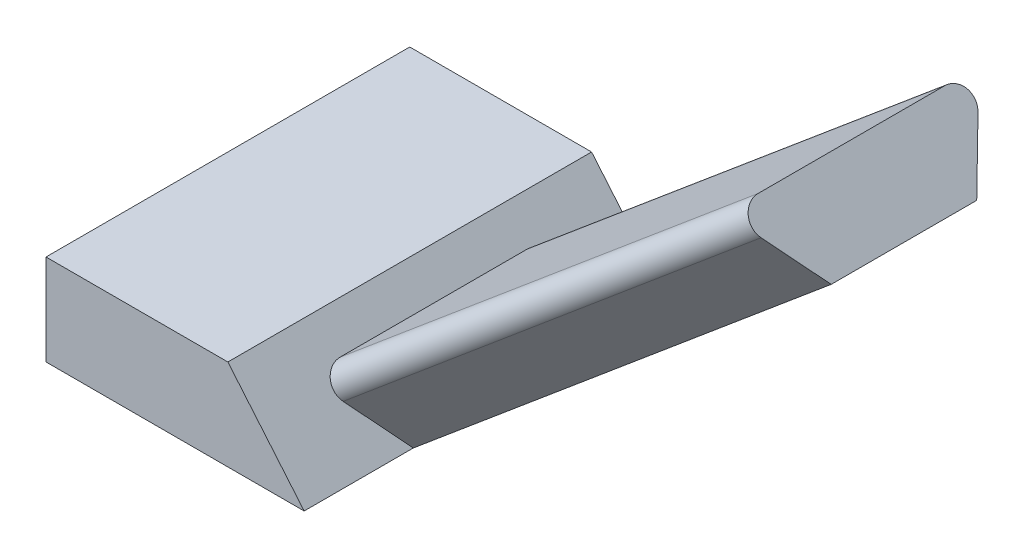
ISO-10303-21;
HEADER;
FILE_DESCRIPTION(('STEP AP214'),'2;1');
FILE_NAME('part.step','',(''),(''),'','','');
FILE_SCHEMA(('AUTOMOTIVE_DESIGN { 1 0 10303 214 1 1 1 1 }'));
ENDSEC;
DATA;
#1=APPLICATION_CONTEXT('core data for automotive mechanical design processes');
#2=APPLICATION_PROTOCOL_DEFINITION('international standard','automotive_design',2000,#1);
#3=PRODUCT_CONTEXT('',#1,'mechanical');
#4=PRODUCT('Part','Part','',(#3));
#5=PRODUCT_RELATED_PRODUCT_CATEGORY('part','',(#4));
#6=PRODUCT_DEFINITION_FORMATION('','',#4);
#7=PRODUCT_DEFINITION_CONTEXT('part definition',#1,'design');
#8=PRODUCT_DEFINITION('design','',#6,#7);
#9=PRODUCT_DEFINITION_SHAPE('','',#8);
#10=(LENGTH_UNIT() NAMED_UNIT(*) SI_UNIT(.MILLI.,.METRE.));
#11=(NAMED_UNIT(*) PLANE_ANGLE_UNIT() SI_UNIT($,.RADIAN.));
#12=(NAMED_UNIT(*) SI_UNIT($,.STERADIAN.) SOLID_ANGLE_UNIT());
#13=UNCERTAINTY_MEASURE_WITH_UNIT(LENGTH_MEASURE(1.E-05),#10,'distance_accuracy_value','');
#14=(GEOMETRIC_REPRESENTATION_CONTEXT(3) GLOBAL_UNCERTAINTY_ASSIGNED_CONTEXT((#13)) GLOBAL_UNIT_ASSIGNED_CONTEXT((#10,
#11,#12)) REPRESENTATION_CONTEXT('',''));
#15=CARTESIAN_POINT('',(0.,0.,0.));
#16=DIRECTION('',(0.,0.,1.));
#17=DIRECTION('',(1.,0.,0.));
#18=AXIS2_PLACEMENT_3D('',#15,#16,#17);
#19=CARTESIAN_POINT('',(10.,5.,10.));
#20=DIRECTION('',(-0.766044443118974,-0.642787609686544,0.));
#21=DIRECTION('',(0.642787609686544,-0.766044443118974,0.));
#22=AXIS2_PLACEMENT_3D('',#19,#20,#21);
#23=PLANE('',#22);
#24=DIRECTION('',(0.534831619836407,-0.637387504373012,-0.55470019622523));
#25=VECTOR('',#24,1.);
#26=CARTESIAN_POINT('',(14.1954981558864,0.,4.));
#27=LINE('',#26,#25);
#28=CARTESIAN_POINT('',(12.3022959352078,2.25623054800107,5.96353320251652));
#29=VERTEX_POINT('',#28);
#30=CARTESIAN_POINT('',(14.1954981558864,0.,4.));
#31=VERTEX_POINT('',#30);
#32=EDGE_CURVE('E57',#29,#31,#27,.T.);
#33=ORIENTED_EDGE('',*,*,#32,.F.);
#34=CARTESIAN_POINT('',(11.9457415219835,2.68115555091641,5.13148290817867));
#35=DIRECTION('',(0.766044443118974,0.642787609686544,0.));
#36=DIRECTION('',(0.642787609686544,-0.766044443118974,0.));
#37=AXIS2_PLACEMENT_3D('',#34,#35,#36);
#38=CIRCLE('',#37,1.);
#39=CARTESIAN_POINT('',(11.302953912297,3.44719999403538,5.13148290817867));
#40=VERTEX_POINT('',#39);
#41=EDGE_CURVE('E61',#40,#29,#38,.T.);
#42=ORIENTED_EDGE('',*,*,#41,.F.);
#43=DIRECTION('',(0.,0.,1.));
#44=VECTOR('',#43,1.);
#45=CARTESIAN_POINT('',(11.302953912297,3.44719999403538,5.13148290817867));
#46=LINE('',#45,#44);
#47=CARTESIAN_POINT('',(11.302953912297,3.44719999403538,-5.13148290817867));
#48=VERTEX_POINT('',#47);
#49=EDGE_CURVE('E215',#48,#40,#46,.T.);
#50=ORIENTED_EDGE('',*,*,#49,.F.);
#51=CARTESIAN_POINT('',(11.9457415219835,2.68115555091641,-5.13148290817867));
#52=DIRECTION('',(0.766044443118974,0.642787609686544,0.));
#53=DIRECTION('',(0.642787609686544,-0.766044443118974,0.));
#54=AXIS2_PLACEMENT_3D('',#51,#52,#53);
#55=CIRCLE('',#54,1.);
#56=CARTESIAN_POINT('',(12.3022959352078,2.25623054800107,-5.96353320251651));
#57=VERTEX_POINT('',#56);
#58=EDGE_CURVE('E220',#57,#48,#55,.T.);
#59=ORIENTED_EDGE('',*,*,#58,.F.);
#60=DIRECTION('',(-0.534831619836407,0.637387504373012,-0.554700196225229));
#61=VECTOR('',#60,1.);
#62=CARTESIAN_POINT('',(12.3022959352078,2.25623054800107,-5.96353320251651));
#63=LINE('',#62,#61);
#64=CARTESIAN_POINT('',(14.1954981558864,0.,-4.));
#65=VERTEX_POINT('',#64);
#66=EDGE_CURVE('E178',#65,#57,#63,.T.);
#67=ORIENTED_EDGE('',*,*,#66,.F.);
#68=DIRECTION('',(0.,0.,-1.));
#69=VECTOR('',#68,1.);
#70=CARTESIAN_POINT('',(14.1954981558864,0.,10.));
#71=LINE('',#70,#69);
#72=CARTESIAN_POINT('',(14.1954981558864,0.,-10.));
#73=VERTEX_POINT('',#72);
#74=EDGE_CURVE('E51',#65,#73,#71,.T.);
#75=ORIENTED_EDGE('',*,*,#74,.T.);
#76=DIRECTION('',(-0.642787609686544,0.766044443118974,0.));
#77=VECTOR('',#76,1.);
#78=CARTESIAN_POINT('',(10.,5.,-10.));
#79=LINE('',#78,#77);
#80=CARTESIAN_POINT('',(10.,5.,-10.));
#81=VERTEX_POINT('',#80);
#82=EDGE_CURVE('E145',#73,#81,#79,.T.);
#83=ORIENTED_EDGE('',*,*,#82,.T.);
#84=DIRECTION('',(0.,0.,-1.));
#85=VECTOR('',#84,1.);
#86=CARTESIAN_POINT('',(10.,5.,10.));
#87=LINE('',#86,#85);
#88=CARTESIAN_POINT('',(10.,5.,10.));
#89=VERTEX_POINT('',#88);
#90=EDGE_CURVE('E170',#89,#81,#87,.T.);
#91=ORIENTED_EDGE('',*,*,#90,.F.);
#92=DIRECTION('',(-0.642787609686544,0.766044443118974,0.));
#93=VECTOR('',#92,1.);
#94=CARTESIAN_POINT('',(10.,5.,10.));
#95=LINE('',#94,#93);
#96=CARTESIAN_POINT('',(14.1954981558864,0.,10.));
#97=VERTEX_POINT('',#96);
#98=EDGE_CURVE('E154',#97,#89,#95,.T.);
#99=ORIENTED_EDGE('',*,*,#98,.F.);
#100=EDGE_CURVE('E11',#97,#31,#71,.T.);
#101=ORIENTED_EDGE('',*,*,#100,.T.);
#102=EDGE_LOOP('',(#33,#42,#50,#59,#67,#75,#83,#91,#99,#101));
#103=FACE_BOUND('',#102,.T.);
#104=ADVANCED_FACE('F43',(#103),#23,.F.);
#105=CARTESIAN_POINT('',(14.1954981558864,0.,10.));
#106=DIRECTION('',(0.,1.,0.));
#107=DIRECTION('',(-1.,0.,0.));
#108=AXIS2_PLACEMENT_3D('',#105,#106,#107);
#109=PLANE('',#108);
#110=DIRECTION('',(1.,0.,0.));
#111=VECTOR('',#110,1.);
#112=CARTESIAN_POINT('',(14.1954981558864,0.,-10.));
#113=LINE('',#112,#111);
#114=CARTESIAN_POINT('',(0.,0.,-10.));
#115=VERTEX_POINT('',#114);
#116=EDGE_CURVE('E142',#115,#73,#113,.T.);
#117=ORIENTED_EDGE('',*,*,#116,.T.);
#118=ORIENTED_EDGE('',*,*,#74,.F.);
#119=DIRECTION('',(0.,0.,-1.));
#120=VECTOR('',#119,1.);
#121=CARTESIAN_POINT('',(14.1954981558864,0.,-4.));
#122=LINE('',#121,#120);
#123=EDGE_CURVE('E141',#31,#65,#122,.T.);
#124=ORIENTED_EDGE('',*,*,#123,.F.);
#125=ORIENTED_EDGE('',*,*,#100,.F.);
#126=DIRECTION('',(1.,0.,0.));
#127=VECTOR('',#126,1.);
#128=CARTESIAN_POINT('',(14.1954981558864,0.,10.));
#129=LINE('',#128,#127);
#130=CARTESIAN_POINT('',(0.,0.,10.));
#131=VERTEX_POINT('',#130);
#132=EDGE_CURVE('E151',#131,#97,#129,.T.);
#133=ORIENTED_EDGE('',*,*,#132,.F.);
#134=DIRECTION('',(0.,0.,-1.));
#135=VECTOR('',#134,1.);
#136=CARTESIAN_POINT('',(0.,0.,10.));
#137=LINE('',#136,#135);
#138=EDGE_CURVE('E160',#131,#115,#137,.T.);
#139=ORIENTED_EDGE('',*,*,#138,.T.);
#140=EDGE_LOOP('',(#117,#118,#124,#125,#133,#139));
#141=FACE_BOUND('',#140,.T.);
#142=ADVANCED_FACE('F45',(#141),#109,.F.);
#143=CARTESIAN_POINT('',(0.,5.,10.));
#144=DIRECTION('',(0.,-1.,0.));
#145=DIRECTION('',(0.,0.,-1.));
#146=AXIS2_PLACEMENT_3D('',#143,#144,#145);
#147=PLANE('',#146);
#148=DIRECTION('',(-1.,0.,0.));
#149=VECTOR('',#148,1.);
#150=CARTESIAN_POINT('',(0.,5.,-10.));
#151=LINE('',#150,#149);
#152=CARTESIAN_POINT('',(0.,5.,-10.));
#153=VERTEX_POINT('',#152);
#154=EDGE_CURVE('E163',#81,#153,#151,.T.);
#155=ORIENTED_EDGE('',*,*,#154,.T.);
#156=DIRECTION('',(0.,0.,-1.));
#157=VECTOR('',#156,1.);
#158=CARTESIAN_POINT('',(0.,5.,10.));
#159=LINE('',#158,#157);
#160=CARTESIAN_POINT('',(0.,5.,10.));
#161=VERTEX_POINT('',#160);
#162=EDGE_CURVE('E168',#161,#153,#159,.T.);
#163=ORIENTED_EDGE('',*,*,#162,.F.);
#164=DIRECTION('',(-1.,0.,0.));
#165=VECTOR('',#164,1.);
#166=CARTESIAN_POINT('',(0.,5.,10.));
#167=LINE('',#166,#165);
#168=EDGE_CURVE('E157',#89,#161,#167,.T.);
#169=ORIENTED_EDGE('',*,*,#168,.F.);
#170=ORIENTED_EDGE('',*,*,#90,.T.);
#171=EDGE_LOOP('',(#155,#163,#169,#170));
#172=FACE_BOUND('',#171,.T.);
#173=ADVANCED_FACE('F191',(#172),#147,.F.);
#174=CARTESIAN_POINT('',(0.,0.,10.));
#175=DIRECTION('',(1.,0.,0.));
#176=DIRECTION('',(0.,0.,-1.));
#177=AXIS2_PLACEMENT_3D('',#174,#175,#176);
#178=PLANE('',#177);
#179=DIRECTION('',(0.,-1.,0.));
#180=VECTOR('',#179,1.);
#181=CARTESIAN_POINT('',(0.,0.,-10.));
#182=LINE('',#181,#180);
#183=EDGE_CURVE('E155',#153,#115,#182,.T.);
#184=ORIENTED_EDGE('',*,*,#183,.T.);
#185=ORIENTED_EDGE('',*,*,#138,.F.);
#186=DIRECTION('',(0.,-1.,0.));
#187=VECTOR('',#186,1.);
#188=CARTESIAN_POINT('',(0.,0.,10.));
#189=LINE('',#188,#187);
#190=EDGE_CURVE('E159',#161,#131,#189,.T.);
#191=ORIENTED_EDGE('',*,*,#190,.F.);
#192=ORIENTED_EDGE('',*,*,#162,.T.);
#193=EDGE_LOOP('',(#184,#185,#191,#192));
#194=FACE_BOUND('',#193,.T.);
#195=ADVANCED_FACE('F189',(#194),#178,.F.);
#196=CARTESIAN_POINT('',(0.,0.,10.));
#197=DIRECTION('',(0.,0.,-1.));
#198=DIRECTION('',(-1.,0.,0.));
#199=AXIS2_PLACEMENT_3D('',#196,#197,#198);
#200=PLANE('',#199);
#201=ORIENTED_EDGE('',*,*,#132,.T.);
#202=ORIENTED_EDGE('',*,*,#98,.T.);
#203=ORIENTED_EDGE('',*,*,#168,.T.);
#204=ORIENTED_EDGE('',*,*,#190,.T.);
#205=EDGE_LOOP('',(#201,#202,#203,#204));
#206=FACE_BOUND('',#205,.T.);
#207=ADVANCED_FACE('F193',(#206),#200,.F.);
#208=CARTESIAN_POINT('',(0.,0.,-10.));
#209=DIRECTION('',(0.,0.,-1.));
#210=DIRECTION('',(-1.,0.,0.));
#211=AXIS2_PLACEMENT_3D('',#208,#209,#210);
#212=PLANE('',#211);
#213=ORIENTED_EDGE('',*,*,#116,.F.);
#214=ORIENTED_EDGE('',*,*,#183,.F.);
#215=ORIENTED_EDGE('',*,*,#154,.F.);
#216=ORIENTED_EDGE('',*,*,#82,.F.);
#217=EDGE_LOOP('',(#213,#214,#215,#216));
#218=FACE_BOUND('',#217,.T.);
#219=ADVANCED_FACE('F182',(#218),#212,.T.);
#220=CARTESIAN_POINT('',(37.1768314494557,19.2836282905963,-4.));
#221=DIRECTION('',(-0.642787609686544,0.766044443118974,0.));
#222=DIRECTION('',(-0.766044443118975,-0.642787609686544,0.));
#223=AXIS2_PLACEMENT_3D('',#220,#221,#222);
#224=PLANE('',#223);
#225=ORIENTED_EDGE('',*,*,#123,.T.);
#226=DIRECTION('',(-0.766044443118974,-0.642787609686544,0.));
#227=VECTOR('',#226,1.);
#228=CARTESIAN_POINT('',(37.1768314494557,19.2836282905963,-4.));
#229=LINE('',#228,#227);
#230=CARTESIAN_POINT('',(37.1768314494557,19.2836282905963,-4.));
#231=VERTEX_POINT('',#230);
#232=EDGE_CURVE('E123',#231,#65,#229,.T.);
#233=ORIENTED_EDGE('',*,*,#232,.F.);
#234=DIRECTION('',(0.,0.,-1.));
#235=VECTOR('',#234,1.);
#236=CARTESIAN_POINT('',(37.1768314494557,19.2836282905963,-4.));
#237=LINE('',#236,#235);
#238=CARTESIAN_POINT('',(37.1768314494557,19.2836282905963,4.));
#239=VERTEX_POINT('',#238);
#240=EDGE_CURVE('E130',#239,#231,#237,.T.);
#241=ORIENTED_EDGE('',*,*,#240,.F.);
#242=DIRECTION('',(-0.766044443118974,-0.642787609686544,0.));
#243=VECTOR('',#242,1.);
#244=CARTESIAN_POINT('',(37.1768314494557,19.2836282905963,4.));
#245=LINE('',#244,#243);
#246=EDGE_CURVE('E197',#239,#31,#245,.T.);
#247=ORIENTED_EDGE('',*,*,#246,.T.);
#248=EDGE_LOOP('',(#225,#233,#241,#247));
#249=FACE_BOUND('',#248,.T.);
#250=ADVANCED_FACE('F140',(#249),#224,.F.);
#251=CARTESIAN_POINT('',(35.2836292287771,21.5398588385974,-5.96353320251651));
#252=DIRECTION('',(-0.356554413224272,0.424925002915341,0.832050294337844));
#253=DIRECTION('',(0.,-0.890584343635462,0.454818125047137));
#254=AXIS2_PLACEMENT_3D('',#251,#252,#253);
#255=PLANE('',#254);
#256=ORIENTED_EDGE('',*,*,#66,.T.);
#257=DIRECTION('',(-0.766044443118974,-0.642787609686544,0.));
#258=VECTOR('',#257,1.);
#259=CARTESIAN_POINT('',(35.2836292287771,21.5398588385974,-5.96353320251651));
#260=LINE('',#259,#258);
#261=CARTESIAN_POINT('',(35.2836292287771,21.5398588385974,-5.96353320251651));
#262=VERTEX_POINT('',#261);
#263=EDGE_CURVE('E126',#262,#57,#260,.T.);
#264=ORIENTED_EDGE('',*,*,#263,.F.);
#265=DIRECTION('',(-0.534831619836407,0.637387504373012,-0.554700196225229));
#266=VECTOR('',#265,1.);
#267=CARTESIAN_POINT('',(35.2836292287771,21.5398588385974,-5.96353320251651));
#268=LINE('',#267,#266);
#269=EDGE_CURVE('E118',#231,#262,#268,.T.);
#270=ORIENTED_EDGE('',*,*,#269,.F.);
#271=ORIENTED_EDGE('',*,*,#232,.T.);
#272=EDGE_LOOP('',(#256,#264,#270,#271));
#273=FACE_BOUND('',#272,.T.);
#274=ADVANCED_FACE('F121',(#273),#255,.F.);
#275=CARTESIAN_POINT('',(34.9270748155528,21.9647838415127,-5.13148290817867));
#276=DIRECTION('',(-0.766044443118974,-0.642787609686544,0.));
#277=DIRECTION('',(0.642787609686544,-0.766044443118975,0.));
#278=AXIS2_PLACEMENT_3D('',#275,#276,#277);
#279=CYLINDRICAL_SURFACE('',#278,1.);
#280=ORIENTED_EDGE('',*,*,#58,.T.);
#281=DIRECTION('',(-0.766044443118974,-0.642787609686544,0.));
#282=VECTOR('',#281,1.);
#283=CARTESIAN_POINT('',(34.2842872058662,22.7308282846317,-5.13148290817867));
#284=LINE('',#283,#282);
#285=CARTESIAN_POINT('',(34.2842872058662,22.7308282846317,-5.13148290817867));
#286=VERTEX_POINT('',#285);
#287=EDGE_CURVE('E147',#286,#48,#284,.T.);
#288=ORIENTED_EDGE('',*,*,#287,.F.);
#289=CARTESIAN_POINT('',(34.9270748155528,21.9647838415127,-5.13148290817867));
#290=DIRECTION('',(0.766044443118974,0.642787609686544,0.));
#291=DIRECTION('',(0.642787609686544,-0.766044443118974,0.));
#292=AXIS2_PLACEMENT_3D('',#289,#290,#291);
#293=CIRCLE('',#292,1.);
#294=EDGE_CURVE('E129',#262,#286,#293,.T.);
#295=ORIENTED_EDGE('',*,*,#294,.F.);
#296=ORIENTED_EDGE('',*,*,#263,.T.);
#297=EDGE_LOOP('',(#280,#288,#295,#296));
#298=FACE_BOUND('',#297,.T.);
#299=ADVANCED_FACE('F219',(#298),#279,.T.);
#300=CARTESIAN_POINT('',(34.2842872058662,22.7308282846317,5.13148290817867));
#301=DIRECTION('',(0.642787609686544,-0.766044443118974,0.));
#302=DIRECTION('',(0.766044443118975,0.642787609686544,0.));
#303=AXIS2_PLACEMENT_3D('',#300,#301,#302);
#304=PLANE('',#303);
#305=ORIENTED_EDGE('',*,*,#49,.T.);
#306=DIRECTION('',(-0.766044443118974,-0.642787609686544,0.));
#307=VECTOR('',#306,1.);
#308=CARTESIAN_POINT('',(34.2842872058662,22.7308282846317,5.13148290817867));
#309=LINE('',#308,#307);
#310=CARTESIAN_POINT('',(34.2842872058662,22.7308282846317,5.13148290817867));
#311=VERTEX_POINT('',#310);
#312=EDGE_CURVE('E202',#311,#40,#309,.T.);
#313=ORIENTED_EDGE('',*,*,#312,.F.);
#314=DIRECTION('',(0.,0.,1.));
#315=VECTOR('',#314,1.);
#316=CARTESIAN_POINT('',(34.2842872058662,22.7308282846317,5.13148290817867));
#317=LINE('',#316,#315);
#318=EDGE_CURVE('E216',#286,#311,#317,.T.);
#319=ORIENTED_EDGE('',*,*,#318,.F.);
#320=ORIENTED_EDGE('',*,*,#287,.T.);
#321=EDGE_LOOP('',(#305,#313,#319,#320));
#322=FACE_BOUND('',#321,.T.);
#323=ADVANCED_FACE('F213',(#322),#304,.F.);
#324=CARTESIAN_POINT('',(34.9270748155528,21.9647838415127,5.13148290817867));
#325=DIRECTION('',(-0.766044443118974,-0.642787609686544,0.));
#326=DIRECTION('',(0.642787609686544,-0.766044443118975,0.));
#327=AXIS2_PLACEMENT_3D('',#324,#325,#326);
#328=CYLINDRICAL_SURFACE('',#327,1.);
#329=ORIENTED_EDGE('',*,*,#41,.T.);
#330=DIRECTION('',(-0.766044443118974,-0.642787609686544,0.));
#331=VECTOR('',#330,1.);
#332=CARTESIAN_POINT('',(35.2836292287771,21.5398588385974,5.96353320251652));
#333=LINE('',#332,#331);
#334=CARTESIAN_POINT('',(35.2836292287771,21.5398588385974,5.96353320251652));
#335=VERTEX_POINT('',#334);
#336=EDGE_CURVE('E199',#335,#29,#333,.T.);
#337=ORIENTED_EDGE('',*,*,#336,.F.);
#338=CARTESIAN_POINT('',(34.9270748155528,21.9647838415127,5.13148290817867));
#339=DIRECTION('',(0.766044443118974,0.642787609686544,0.));
#340=DIRECTION('',(0.642787609686544,-0.766044443118974,0.));
#341=AXIS2_PLACEMENT_3D('',#338,#339,#340);
#342=CIRCLE('',#341,1.);
#343=EDGE_CURVE('E204',#311,#335,#342,.T.);
#344=ORIENTED_EDGE('',*,*,#343,.F.);
#345=ORIENTED_EDGE('',*,*,#312,.T.);
#346=EDGE_LOOP('',(#329,#337,#344,#345));
#347=FACE_BOUND('',#346,.T.);
#348=ADVANCED_FACE('F226',(#347),#328,.T.);
#349=CARTESIAN_POINT('',(37.1768314494557,19.2836282905963,4.));
#350=DIRECTION('',(-0.356554413224272,0.424925002915342,-0.832050294337843));
#351=DIRECTION('',(0.,0.890584343635462,0.454818125047137));
#352=AXIS2_PLACEMENT_3D('',#349,#350,#351);
#353=PLANE('',#352);
#354=ORIENTED_EDGE('',*,*,#32,.T.);
#355=ORIENTED_EDGE('',*,*,#246,.F.);
#356=DIRECTION('',(0.534831619836407,-0.637387504373012,-0.55470019622523));
#357=VECTOR('',#356,1.);
#358=CARTESIAN_POINT('',(37.1768314494557,19.2836282905963,4.));
#359=LINE('',#358,#357);
#360=EDGE_CURVE('E135',#335,#239,#359,.T.);
#361=ORIENTED_EDGE('',*,*,#360,.F.);
#362=ORIENTED_EDGE('',*,*,#336,.T.);
#363=EDGE_LOOP('',(#354,#355,#361,#362));
#364=FACE_BOUND('',#363,.T.);
#365=ADVANCED_FACE('F196',(#364),#353,.F.);
#366=CARTESIAN_POINT('',(34.9270748155528,21.9647838415127,5.13148290817867));
#367=DIRECTION('',(-0.766044443118974,-0.642787609686544,0.));
#368=DIRECTION('',(0.642787609686544,-0.766044443118974,0.));
#369=AXIS2_PLACEMENT_3D('',#366,#367,#368);
#370=PLANE('',#369);
#371=ORIENTED_EDGE('',*,*,#240,.T.);
#372=ORIENTED_EDGE('',*,*,#269,.T.);
#373=ORIENTED_EDGE('',*,*,#294,.T.);
#374=ORIENTED_EDGE('',*,*,#318,.T.);
#375=ORIENTED_EDGE('',*,*,#343,.T.);
#376=ORIENTED_EDGE('',*,*,#360,.T.);
#377=EDGE_LOOP('',(#371,#372,#373,#374,#375,#376));
#378=FACE_BOUND('',#377,.T.);
#379=ADVANCED_FACE('F133',(#378),#370,.F.);
#380=CLOSED_SHELL('',(#104,#142,#173,#195,#207,#219,#250,#274,#299,#323,#348,#365,#379));
#381=MANIFOLD_SOLID_BREP('B2',#380);
#382=ADVANCED_BREP_SHAPE_REPRESENTATION('',(#18,#381),#14);
#383=SHAPE_DEFINITION_REPRESENTATION(#9,#382);
ENDSEC;
END-ISO-10303-21;
